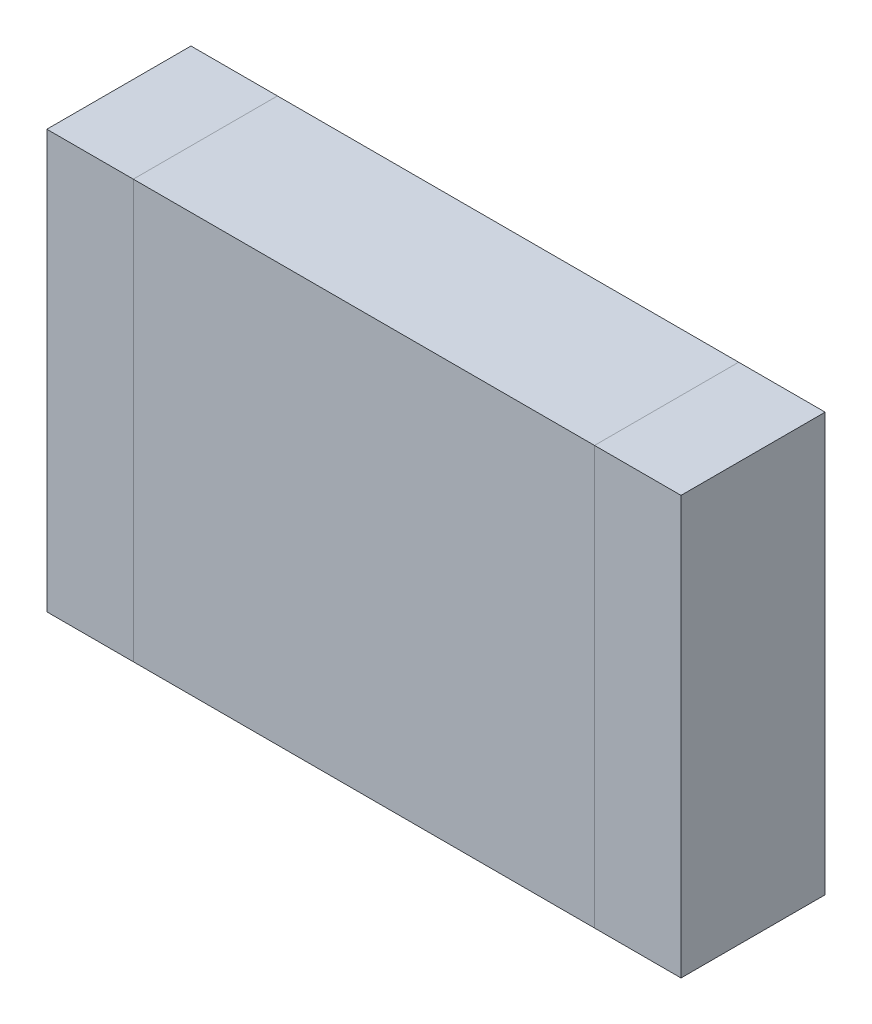
ISO-10303-21;
HEADER;
FILE_DESCRIPTION(('STEP AP214'),'2;1');
FILE_NAME('part.step','',(''),(''),'','','');
FILE_SCHEMA(('AUTOMOTIVE_DESIGN { 1 0 10303 214 1 1 1 1 }'));
ENDSEC;
DATA;
#1=APPLICATION_CONTEXT('core data for automotive mechanical design processes');
#2=APPLICATION_PROTOCOL_DEFINITION('international standard','automotive_design',2000,#1);
#3=PRODUCT_CONTEXT('',#1,'mechanical');
#4=PRODUCT('Part','Part','',(#3));
#5=PRODUCT_RELATED_PRODUCT_CATEGORY('part','',(#4));
#6=PRODUCT_DEFINITION_FORMATION('','',#4);
#7=PRODUCT_DEFINITION_CONTEXT('part definition',#1,'design');
#8=PRODUCT_DEFINITION('design','',#6,#7);
#9=PRODUCT_DEFINITION_SHAPE('','',#8);
#10=(LENGTH_UNIT() NAMED_UNIT(*) SI_UNIT(.MILLI.,.METRE.));
#11=(NAMED_UNIT(*) PLANE_ANGLE_UNIT() SI_UNIT($,.RADIAN.));
#12=(NAMED_UNIT(*) SI_UNIT($,.STERADIAN.) SOLID_ANGLE_UNIT());
#13=UNCERTAINTY_MEASURE_WITH_UNIT(LENGTH_MEASURE(1.E-05),#10,'distance_accuracy_value','');
#14=(GEOMETRIC_REPRESENTATION_CONTEXT(3) GLOBAL_UNCERTAINTY_ASSIGNED_CONTEXT((#13)) GLOBAL_UNIT_ASSIGNED_CONTEXT((#10,
#11,#12)) REPRESENTATION_CONTEXT('',''));
#15=CARTESIAN_POINT('',(0.,0.,0.));
#16=DIRECTION('',(0.,0.,1.));
#17=DIRECTION('',(1.,0.,0.));
#18=AXIS2_PLACEMENT_3D('',#15,#16,#17);
#19=CARTESIAN_POINT('',(1.10000038146973,-0.724999785423279,0.));
#20=DIRECTION('',(1.,0.,0.));
#21=DIRECTION('',(0.,0.,-1.));
#22=AXIS2_PLACEMENT_3D('',#19,#20,#21);
#23=PLANE('',#22);
#24=DIRECTION('',(0.,1.,0.));
#25=VECTOR('',#24,1.);
#26=CARTESIAN_POINT('',(1.10000038146973,1.39999973773956,0.499998986721039));
#27=LINE('',#26,#25);
#28=CARTESIAN_POINT('',(1.10000038146973,-0.724999785423279,0.499998986721039));
#29=VERTEX_POINT('',#28);
#30=CARTESIAN_POINT('',(1.10000038146973,0.724999845027924,0.499998986721039));
#31=VERTEX_POINT('',#30);
#32=EDGE_CURVE('P0_E69',#29,#31,#27,.T.);
#33=ORIENTED_EDGE('',*,*,#32,.F.);
#34=DIRECTION('',(0.,0.,-1.));
#35=VECTOR('',#34,1.);
#36=CARTESIAN_POINT('',(1.10000038146973,-0.724999785423279,0.));
#37=LINE('',#36,#35);
#38=CARTESIAN_POINT('',(1.10000038146973,-0.724999785423279,0.));
#39=VERTEX_POINT('',#38);
#40=EDGE_CURVE('P0_E56',#39,#29,#37,.F.);
#41=ORIENTED_EDGE('',*,*,#40,.F.);
#42=DIRECTION('',(0.,1.,0.));
#43=VECTOR('',#42,1.);
#44=CARTESIAN_POINT('',(1.10000038146973,1.39999973773956,0.));
#45=LINE('',#44,#43);
#46=CARTESIAN_POINT('',(1.10000038146973,0.724999845027924,0.));
#47=VERTEX_POINT('',#46);
#48=EDGE_CURVE('P0_E62',#39,#47,#45,.T.);
#49=ORIENTED_EDGE('',*,*,#48,.T.);
#50=DIRECTION('',(0.,0.,-1.));
#51=VECTOR('',#50,1.);
#52=CARTESIAN_POINT('',(1.10000038146973,0.724999845027924,0.));
#53=LINE('',#52,#51);
#54=EDGE_CURVE('P0_E20',#47,#31,#53,.F.);
#55=ORIENTED_EDGE('',*,*,#54,.T.);
#56=EDGE_LOOP('',(#33,#41,#49,#55));
#57=FACE_BOUND('',#56,.T.);
#58=ADVANCED_FACE('P0_F17',(#57),#23,.T.);
#59=CARTESIAN_POINT('',(-19.3250007629395,1.39999973773956,0.));
#60=DIRECTION('',(0.,0.,1.));
#61=DIRECTION('',(1.,0.,0.));
#62=AXIS2_PLACEMENT_3D('',#59,#60,#61);
#63=PLANE('',#62);
#64=ORIENTED_EDGE('',*,*,#48,.F.);
#65=DIRECTION('',(1.,0.,0.));
#66=VECTOR('',#65,1.);
#67=CARTESIAN_POINT('',(0.80000114440918,-0.724999785423279,0.));
#68=LINE('',#67,#66);
#69=CARTESIAN_POINT('',(0.80000114440918,-0.724999785423279,0.));
#70=VERTEX_POINT('',#69);
#71=EDGE_CURVE('P0_E64',#70,#39,#68,.T.);
#72=ORIENTED_EDGE('',*,*,#71,.F.);
#73=DIRECTION('',(0.,1.,0.));
#74=VECTOR('',#73,1.);
#75=CARTESIAN_POINT('',(0.80000114440918,0.724999845027924,0.));
#76=LINE('',#75,#74);
#77=CARTESIAN_POINT('',(0.80000114440918,0.724999845027924,0.));
#78=VERTEX_POINT('',#77);
#79=EDGE_CURVE('P0_E83',#78,#70,#76,.F.);
#80=ORIENTED_EDGE('',*,*,#79,.F.);
#81=DIRECTION('',(1.,0.,0.));
#82=VECTOR('',#81,1.);
#83=CARTESIAN_POINT('',(1.10000038146973,0.724999845027924,0.));
#84=LINE('',#83,#82);
#85=EDGE_CURVE('P0_E67',#47,#78,#84,.F.);
#86=ORIENTED_EDGE('',*,*,#85,.F.);
#87=EDGE_LOOP('',(#64,#72,#80,#86));
#88=FACE_BOUND('',#87,.T.);
#89=ADVANCED_FACE('P0_F63',(#88),#63,.F.);
#90=CARTESIAN_POINT('',(0.80000114440918,-0.724999785423279,0.));
#91=DIRECTION('',(0.,-1.,0.));
#92=DIRECTION('',(0.,0.,-1.));
#93=AXIS2_PLACEMENT_3D('',#90,#91,#92);
#94=PLANE('',#93);
#95=DIRECTION('',(1.,0.,0.));
#96=VECTOR('',#95,1.);
#97=CARTESIAN_POINT('',(-19.3250007629395,-0.724999785423279,0.499998986721039));
#98=LINE('',#97,#96);
#99=CARTESIAN_POINT('',(0.80000114440918,-0.724999785423279,0.499998986721039));
#100=VERTEX_POINT('',#99);
#101=EDGE_CURVE('P0_E71',#100,#29,#98,.T.);
#102=ORIENTED_EDGE('',*,*,#101,.F.);
#103=DIRECTION('',(0.,0.,1.));
#104=VECTOR('',#103,1.);
#105=CARTESIAN_POINT('',(0.80000114440918,-0.724999785423279,0.));
#106=LINE('',#105,#104);
#107=EDGE_CURVE('P0_E75',#70,#100,#106,.T.);
#108=ORIENTED_EDGE('',*,*,#107,.F.);
#109=ORIENTED_EDGE('',*,*,#71,.T.);
#110=ORIENTED_EDGE('',*,*,#40,.T.);
#111=EDGE_LOOP('',(#102,#108,#109,#110));
#112=FACE_BOUND('',#111,.T.);
#113=ADVANCED_FACE('P0_F73',(#112),#94,.T.);
#114=CARTESIAN_POINT('',(-19.3250007629395,1.39999973773956,0.499998986721039));
#115=DIRECTION('',(0.,0.,1.));
#116=DIRECTION('',(1.,0.,0.));
#117=AXIS2_PLACEMENT_3D('',#114,#115,#116);
#118=PLANE('',#117);
#119=ORIENTED_EDGE('',*,*,#32,.T.);
#120=DIRECTION('',(1.,0.,0.));
#121=VECTOR('',#120,1.);
#122=CARTESIAN_POINT('',(1.10000038146973,0.724999845027924,0.499998986721039));
#123=LINE('',#122,#121);
#124=CARTESIAN_POINT('',(0.80000114440918,0.724999845027924,0.499998986721039));
#125=VERTEX_POINT('',#124);
#126=EDGE_CURVE('P0_E35',#125,#31,#123,.T.);
#127=ORIENTED_EDGE('',*,*,#126,.F.);
#128=DIRECTION('',(0.,1.,0.));
#129=VECTOR('',#128,1.);
#130=CARTESIAN_POINT('',(0.80000114440918,0.724999845027924,0.499998986721039));
#131=LINE('',#130,#129);
#132=EDGE_CURVE('P0_E26',#100,#125,#131,.T.);
#133=ORIENTED_EDGE('',*,*,#132,.F.);
#134=ORIENTED_EDGE('',*,*,#101,.T.);
#135=EDGE_LOOP('',(#119,#127,#133,#134));
#136=FACE_BOUND('',#135,.T.);
#137=ADVANCED_FACE('P0_F89',(#136),#118,.T.);
#138=CARTESIAN_POINT('',(1.10000038146973,0.724999845027924,0.));
#139=DIRECTION('',(0.,1.,0.));
#140=DIRECTION('',(0.,0.,1.));
#141=AXIS2_PLACEMENT_3D('',#138,#139,#140);
#142=PLANE('',#141);
#143=ORIENTED_EDGE('',*,*,#126,.T.);
#144=ORIENTED_EDGE('',*,*,#54,.F.);
#145=ORIENTED_EDGE('',*,*,#85,.T.);
#146=DIRECTION('',(0.,0.,1.));
#147=VECTOR('',#146,1.);
#148=CARTESIAN_POINT('',(0.80000114440918,0.724999845027924,0.));
#149=LINE('',#148,#147);
#150=EDGE_CURVE('P0_E11',#125,#78,#149,.F.);
#151=ORIENTED_EDGE('',*,*,#150,.F.);
#152=EDGE_LOOP('',(#143,#144,#145,#151));
#153=FACE_BOUND('',#152,.T.);
#154=ADVANCED_FACE('P0_F91',(#153),#142,.T.);
#155=CARTESIAN_POINT('',(0.80000114440918,0.724999845027924,0.));
#156=DIRECTION('',(-1.,0.,0.));
#157=DIRECTION('',(0.,0.,1.));
#158=AXIS2_PLACEMENT_3D('',#155,#156,#157);
#159=PLANE('',#158);
#160=ORIENTED_EDGE('',*,*,#132,.T.);
#161=ORIENTED_EDGE('',*,*,#150,.T.);
#162=ORIENTED_EDGE('',*,*,#79,.T.);
#163=ORIENTED_EDGE('',*,*,#107,.T.);
#164=EDGE_LOOP('',(#160,#161,#162,#163));
#165=FACE_BOUND('',#164,.T.);
#166=ADVANCED_FACE('P0_F88',(#165),#159,.T.);
#167=CLOSED_SHELL('',(#58,#89,#113,#137,#154,#166));
#168=MANIFOLD_SOLID_BREP('P0_B1',#167);
#169=CARTESIAN_POINT('',(-19.3250007629395,1.39999973773956,0.));
#170=DIRECTION('',(0.,0.,1.));
#171=DIRECTION('',(1.,0.,0.));
#172=AXIS2_PLACEMENT_3D('',#169,#170,#171);
#173=PLANE('',#172);
#174=DIRECTION('',(0.,1.,0.));
#175=VECTOR('',#174,1.);
#176=CARTESIAN_POINT('',(0.80000114440918,-0.724999785423279,0.));
#177=LINE('',#176,#175);
#178=CARTESIAN_POINT('',(0.80000114440918,-0.724999785423279,0.));
#179=VERTEX_POINT('',#178);
#180=CARTESIAN_POINT('',(0.80000114440918,0.724999845027924,0.));
#181=VERTEX_POINT('',#180);
#182=EDGE_CURVE('P1_E55',#179,#181,#177,.T.);
#183=ORIENTED_EDGE('',*,*,#182,.F.);
#184=DIRECTION('',(1.,0.,0.));
#185=VECTOR('',#184,1.);
#186=CARTESIAN_POINT('',(-0.799999237060547,-0.724999785423279,0.));
#187=LINE('',#186,#185);
#188=CARTESIAN_POINT('',(-0.799999237060547,-0.724999785423279,0.));
#189=VERTEX_POINT('',#188);
#190=EDGE_CURVE('P1_E57',#189,#179,#187,.T.);
#191=ORIENTED_EDGE('',*,*,#190,.F.);
#192=DIRECTION('',(0.,1.,0.));
#193=VECTOR('',#192,1.);
#194=CARTESIAN_POINT('',(-0.799999237060547,0.724999845027924,0.));
#195=LINE('',#194,#193);
#196=CARTESIAN_POINT('',(-0.799999237060547,0.724999845027924,0.));
#197=VERTEX_POINT('',#196);
#198=EDGE_CURVE('P1_E20',#197,#189,#195,.F.);
#199=ORIENTED_EDGE('',*,*,#198,.F.);
#200=DIRECTION('',(1.,0.,0.));
#201=VECTOR('',#200,1.);
#202=CARTESIAN_POINT('',(0.80000114440918,0.724999845027924,0.));
#203=LINE('',#202,#201);
#204=EDGE_CURVE('P1_E79',#181,#197,#203,.F.);
#205=ORIENTED_EDGE('',*,*,#204,.F.);
#206=EDGE_LOOP('',(#183,#191,#199,#205));
#207=FACE_BOUND('',#206,.T.);
#208=ADVANCED_FACE('P1_F17',(#207),#173,.F.);
#209=CARTESIAN_POINT('',(-0.799999237060547,0.724999845027924,0.));
#210=DIRECTION('',(-1.,0.,0.));
#211=DIRECTION('',(0.,0.,1.));
#212=AXIS2_PLACEMENT_3D('',#209,#210,#211);
#213=PLANE('',#212);
#214=DIRECTION('',(0.,1.,0.));
#215=VECTOR('',#214,1.);
#216=CARTESIAN_POINT('',(-0.799999237060547,1.39999973773956,0.499998986721039));
#217=LINE('',#216,#215);
#218=CARTESIAN_POINT('',(-0.799999237060547,0.724999845027924,0.499998986721039));
#219=VERTEX_POINT('',#218);
#220=CARTESIAN_POINT('',(-0.799999237060547,-0.724999785423279,0.499998986721039));
#221=VERTEX_POINT('',#220);
#222=EDGE_CURVE('P1_E83',#219,#221,#217,.F.);
#223=ORIENTED_EDGE('',*,*,#222,.F.);
#224=DIRECTION('',(0.,0.,1.));
#225=VECTOR('',#224,1.);
#226=CARTESIAN_POINT('',(-0.799999237060547,0.724999845027924,0.));
#227=LINE('',#226,#225);
#228=EDGE_CURVE('P1_E68',#197,#219,#227,.T.);
#229=ORIENTED_EDGE('',*,*,#228,.F.);
#230=ORIENTED_EDGE('',*,*,#198,.T.);
#231=DIRECTION('',(0.,0.,-1.));
#232=VECTOR('',#231,1.);
#233=CARTESIAN_POINT('',(-0.799999237060547,-0.724999785423279,0.));
#234=LINE('',#233,#232);
#235=EDGE_CURVE('P1_E63',#221,#189,#234,.T.);
#236=ORIENTED_EDGE('',*,*,#235,.F.);
#237=EDGE_LOOP('',(#223,#229,#230,#236));
#238=FACE_BOUND('',#237,.T.);
#239=ADVANCED_FACE('P1_F65',(#238),#213,.T.);
#240=CARTESIAN_POINT('',(-0.799999237060547,-0.724999785423279,0.));
#241=DIRECTION('',(0.,-1.,0.));
#242=DIRECTION('',(0.,0.,-1.));
#243=AXIS2_PLACEMENT_3D('',#240,#241,#242);
#244=PLANE('',#243);
#245=DIRECTION('',(1.,0.,0.));
#246=VECTOR('',#245,1.);
#247=CARTESIAN_POINT('',(-19.3250007629395,-0.724999785423279,0.499998986721039));
#248=LINE('',#247,#246);
#249=CARTESIAN_POINT('',(0.80000114440918,-0.724999785423279,0.499998986721039));
#250=VERTEX_POINT('',#249);
#251=EDGE_CURVE('P1_E72',#221,#250,#248,.T.);
#252=ORIENTED_EDGE('',*,*,#251,.F.);
#253=ORIENTED_EDGE('',*,*,#235,.T.);
#254=ORIENTED_EDGE('',*,*,#190,.T.);
#255=DIRECTION('',(0.,0.,-1.));
#256=VECTOR('',#255,1.);
#257=CARTESIAN_POINT('',(0.80000114440918,-0.724999785423279,0.));
#258=LINE('',#257,#256);
#259=EDGE_CURVE('P1_E75',#250,#179,#258,.T.);
#260=ORIENTED_EDGE('',*,*,#259,.F.);
#261=EDGE_LOOP('',(#252,#253,#254,#260));
#262=FACE_BOUND('',#261,.T.);
#263=ADVANCED_FACE('P1_F70',(#262),#244,.T.);
#264=CARTESIAN_POINT('',(0.80000114440918,-0.724999785423279,0.));
#265=DIRECTION('',(1.,0.,0.));
#266=DIRECTION('',(0.,0.,-1.));
#267=AXIS2_PLACEMENT_3D('',#264,#265,#266);
#268=PLANE('',#267);
#269=DIRECTION('',(0.,1.,0.));
#270=VECTOR('',#269,1.);
#271=CARTESIAN_POINT('',(0.800001144409181,1.39999973773956,0.499998986721039));
#272=LINE('',#271,#270);
#273=CARTESIAN_POINT('',(0.80000114440918,0.724999845027924,0.499998986721039));
#274=VERTEX_POINT('',#273);
#275=EDGE_CURVE('P1_E26',#250,#274,#272,.T.);
#276=ORIENTED_EDGE('',*,*,#275,.F.);
#277=ORIENTED_EDGE('',*,*,#259,.T.);
#278=ORIENTED_EDGE('',*,*,#182,.T.);
#279=DIRECTION('',(0.,0.,1.));
#280=VECTOR('',#279,1.);
#281=CARTESIAN_POINT('',(0.80000114440918,0.724999845027924,0.));
#282=LINE('',#281,#280);
#283=EDGE_CURVE('P1_E35',#274,#181,#282,.F.);
#284=ORIENTED_EDGE('',*,*,#283,.F.);
#285=EDGE_LOOP('',(#276,#277,#278,#284));
#286=FACE_BOUND('',#285,.T.);
#287=ADVANCED_FACE('P1_F89',(#286),#268,.T.);
#288=CARTESIAN_POINT('',(0.80000114440918,0.724999845027924,0.));
#289=DIRECTION('',(0.,1.,0.));
#290=DIRECTION('',(0.,0.,1.));
#291=AXIS2_PLACEMENT_3D('',#288,#289,#290);
#292=PLANE('',#291);
#293=DIRECTION('',(1.,0.,0.));
#294=VECTOR('',#293,1.);
#295=CARTESIAN_POINT('',(-19.3250007629395,0.724999845027924,0.499998986721039));
#296=LINE('',#295,#294);
#297=EDGE_CURVE('P1_E11',#274,#219,#296,.F.);
#298=ORIENTED_EDGE('',*,*,#297,.F.);
#299=ORIENTED_EDGE('',*,*,#283,.T.);
#300=ORIENTED_EDGE('',*,*,#204,.T.);
#301=ORIENTED_EDGE('',*,*,#228,.T.);
#302=EDGE_LOOP('',(#298,#299,#300,#301));
#303=FACE_BOUND('',#302,.T.);
#304=ADVANCED_FACE('P1_F91',(#303),#292,.T.);
#305=CARTESIAN_POINT('',(-19.3250007629395,1.39999973773956,0.499998986721039));
#306=DIRECTION('',(0.,0.,1.));
#307=DIRECTION('',(1.,0.,0.));
#308=AXIS2_PLACEMENT_3D('',#305,#306,#307);
#309=PLANE('',#308);
#310=ORIENTED_EDGE('',*,*,#275,.T.);
#311=ORIENTED_EDGE('',*,*,#297,.T.);
#312=ORIENTED_EDGE('',*,*,#222,.T.);
#313=ORIENTED_EDGE('',*,*,#251,.T.);
#314=EDGE_LOOP('',(#310,#311,#312,#313));
#315=FACE_BOUND('',#314,.T.);
#316=ADVANCED_FACE('P1_F88',(#315),#309,.T.);
#317=CLOSED_SHELL('',(#208,#239,#263,#287,#304,#316));
#318=MANIFOLD_SOLID_BREP('P1_B1',#317);
#319=CARTESIAN_POINT('',(-0.799999237060547,-0.724999785423279,0.));
#320=DIRECTION('',(1.,0.,0.));
#321=DIRECTION('',(0.,0.,-1.));
#322=AXIS2_PLACEMENT_3D('',#319,#320,#321);
#323=PLANE('',#322);
#324=DIRECTION('',(0.,1.,0.));
#325=VECTOR('',#324,1.);
#326=CARTESIAN_POINT('',(-0.799999237060547,1.39999973773956,0.499998986721039));
#327=LINE('',#326,#325);
#328=CARTESIAN_POINT('',(-0.799999237060547,-0.724999785423279,0.499998986721039));
#329=VERTEX_POINT('',#328);
#330=CARTESIAN_POINT('',(-0.799999237060547,0.724999845027924,0.499998986721039));
#331=VERTEX_POINT('',#330);
#332=EDGE_CURVE('P2_E69',#329,#331,#327,.T.);
#333=ORIENTED_EDGE('',*,*,#332,.F.);
#334=DIRECTION('',(0.,0.,-1.));
#335=VECTOR('',#334,1.);
#336=CARTESIAN_POINT('',(-0.799999237060547,-0.724999785423279,0.));
#337=LINE('',#336,#335);
#338=CARTESIAN_POINT('',(-0.799999237060547,-0.724999785423279,0.));
#339=VERTEX_POINT('',#338);
#340=EDGE_CURVE('P2_E56',#339,#329,#337,.F.);
#341=ORIENTED_EDGE('',*,*,#340,.F.);
#342=DIRECTION('',(0.,1.,0.));
#343=VECTOR('',#342,1.);
#344=CARTESIAN_POINT('',(-0.799999237060547,1.39999973773956,0.));
#345=LINE('',#344,#343);
#346=CARTESIAN_POINT('',(-0.799999237060547,0.724999845027924,0.));
#347=VERTEX_POINT('',#346);
#348=EDGE_CURVE('P2_E62',#339,#347,#345,.T.);
#349=ORIENTED_EDGE('',*,*,#348,.T.);
#350=DIRECTION('',(0.,0.,-1.));
#351=VECTOR('',#350,1.);
#352=CARTESIAN_POINT('',(-0.799999237060547,0.724999845027924,0.));
#353=LINE('',#352,#351);
#354=EDGE_CURVE('P2_E20',#347,#331,#353,.F.);
#355=ORIENTED_EDGE('',*,*,#354,.T.);
#356=EDGE_LOOP('',(#333,#341,#349,#355));
#357=FACE_BOUND('',#356,.T.);
#358=ADVANCED_FACE('P2_F17',(#357),#323,.T.);
#359=CARTESIAN_POINT('',(-19.3250007629395,1.39999973773956,0.));
#360=DIRECTION('',(0.,0.,1.));
#361=DIRECTION('',(1.,0.,0.));
#362=AXIS2_PLACEMENT_3D('',#359,#360,#361);
#363=PLANE('',#362);
#364=ORIENTED_EDGE('',*,*,#348,.F.);
#365=DIRECTION('',(1.,0.,0.));
#366=VECTOR('',#365,1.);
#367=CARTESIAN_POINT('',(-1.10000038146973,-0.724999785423279,0.));
#368=LINE('',#367,#366);
#369=CARTESIAN_POINT('',(-1.10000038146973,-0.724999785423279,0.));
#370=VERTEX_POINT('',#369);
#371=EDGE_CURVE('P2_E64',#370,#339,#368,.T.);
#372=ORIENTED_EDGE('',*,*,#371,.F.);
#373=DIRECTION('',(0.,1.,0.));
#374=VECTOR('',#373,1.);
#375=CARTESIAN_POINT('',(-1.10000038146973,0.724999845027924,0.));
#376=LINE('',#375,#374);
#377=CARTESIAN_POINT('',(-1.10000038146973,0.724999845027924,0.));
#378=VERTEX_POINT('',#377);
#379=EDGE_CURVE('P2_E83',#378,#370,#376,.F.);
#380=ORIENTED_EDGE('',*,*,#379,.F.);
#381=DIRECTION('',(1.,0.,0.));
#382=VECTOR('',#381,1.);
#383=CARTESIAN_POINT('',(-0.799999237060547,0.724999845027924,0.));
#384=LINE('',#383,#382);
#385=EDGE_CURVE('P2_E67',#347,#378,#384,.F.);
#386=ORIENTED_EDGE('',*,*,#385,.F.);
#387=EDGE_LOOP('',(#364,#372,#380,#386));
#388=FACE_BOUND('',#387,.T.);
#389=ADVANCED_FACE('P2_F63',(#388),#363,.F.);
#390=CARTESIAN_POINT('',(-1.10000038146973,-0.724999785423279,0.));
#391=DIRECTION('',(0.,-1.,0.));
#392=DIRECTION('',(0.,0.,-1.));
#393=AXIS2_PLACEMENT_3D('',#390,#391,#392);
#394=PLANE('',#393);
#395=DIRECTION('',(1.,0.,0.));
#396=VECTOR('',#395,1.);
#397=CARTESIAN_POINT('',(-19.3250007629395,-0.724999785423279,0.499998986721039));
#398=LINE('',#397,#396);
#399=CARTESIAN_POINT('',(-1.10000038146973,-0.724999785423279,0.499998986721039));
#400=VERTEX_POINT('',#399);
#401=EDGE_CURVE('P2_E71',#400,#329,#398,.T.);
#402=ORIENTED_EDGE('',*,*,#401,.F.);
#403=DIRECTION('',(0.,0.,1.));
#404=VECTOR('',#403,1.);
#405=CARTESIAN_POINT('',(-1.10000038146973,-0.724999785423279,0.));
#406=LINE('',#405,#404);
#407=EDGE_CURVE('P2_E75',#370,#400,#406,.T.);
#408=ORIENTED_EDGE('',*,*,#407,.F.);
#409=ORIENTED_EDGE('',*,*,#371,.T.);
#410=ORIENTED_EDGE('',*,*,#340,.T.);
#411=EDGE_LOOP('',(#402,#408,#409,#410));
#412=FACE_BOUND('',#411,.T.);
#413=ADVANCED_FACE('P2_F73',(#412),#394,.T.);
#414=CARTESIAN_POINT('',(-19.3250007629395,1.39999973773956,0.499998986721039));
#415=DIRECTION('',(0.,0.,1.));
#416=DIRECTION('',(1.,0.,0.));
#417=AXIS2_PLACEMENT_3D('',#414,#415,#416);
#418=PLANE('',#417);
#419=ORIENTED_EDGE('',*,*,#332,.T.);
#420=DIRECTION('',(1.,0.,0.));
#421=VECTOR('',#420,1.);
#422=CARTESIAN_POINT('',(-0.799999237060547,0.724999845027924,0.499998986721039));
#423=LINE('',#422,#421);
#424=CARTESIAN_POINT('',(-1.10000038146973,0.724999845027924,0.499998986721039));
#425=VERTEX_POINT('',#424);
#426=EDGE_CURVE('P2_E35',#425,#331,#423,.T.);
#427=ORIENTED_EDGE('',*,*,#426,.F.);
#428=DIRECTION('',(0.,1.,0.));
#429=VECTOR('',#428,1.);
#430=CARTESIAN_POINT('',(-1.10000038146973,0.724999845027924,0.499998986721039));
#431=LINE('',#430,#429);
#432=EDGE_CURVE('P2_E26',#400,#425,#431,.T.);
#433=ORIENTED_EDGE('',*,*,#432,.F.);
#434=ORIENTED_EDGE('',*,*,#401,.T.);
#435=EDGE_LOOP('',(#419,#427,#433,#434));
#436=FACE_BOUND('',#435,.T.);
#437=ADVANCED_FACE('P2_F89',(#436),#418,.T.);
#438=CARTESIAN_POINT('',(-0.799999237060547,0.724999845027924,0.));
#439=DIRECTION('',(0.,1.,0.));
#440=DIRECTION('',(0.,0.,1.));
#441=AXIS2_PLACEMENT_3D('',#438,#439,#440);
#442=PLANE('',#441);
#443=ORIENTED_EDGE('',*,*,#426,.T.);
#444=ORIENTED_EDGE('',*,*,#354,.F.);
#445=ORIENTED_EDGE('',*,*,#385,.T.);
#446=DIRECTION('',(0.,0.,1.));
#447=VECTOR('',#446,1.);
#448=CARTESIAN_POINT('',(-1.10000038146973,0.724999845027924,0.));
#449=LINE('',#448,#447);
#450=EDGE_CURVE('P2_E11',#425,#378,#449,.F.);
#451=ORIENTED_EDGE('',*,*,#450,.F.);
#452=EDGE_LOOP('',(#443,#444,#445,#451));
#453=FACE_BOUND('',#452,.T.);
#454=ADVANCED_FACE('P2_F91',(#453),#442,.T.);
#455=CARTESIAN_POINT('',(-1.10000038146973,0.724999845027924,0.));
#456=DIRECTION('',(-1.,0.,0.));
#457=DIRECTION('',(0.,0.,1.));
#458=AXIS2_PLACEMENT_3D('',#455,#456,#457);
#459=PLANE('',#458);
#460=ORIENTED_EDGE('',*,*,#432,.T.);
#461=ORIENTED_EDGE('',*,*,#450,.T.);
#462=ORIENTED_EDGE('',*,*,#379,.T.);
#463=ORIENTED_EDGE('',*,*,#407,.T.);
#464=EDGE_LOOP('',(#460,#461,#462,#463));
#465=FACE_BOUND('',#464,.T.);
#466=ADVANCED_FACE('P2_F88',(#465),#459,.T.);
#467=CLOSED_SHELL('',(#358,#389,#413,#437,#454,#466));
#468=MANIFOLD_SOLID_BREP('P2_B1',#467);
#469=ADVANCED_BREP_SHAPE_REPRESENTATION('',(#18,#168,#318,#468),#14);
#470=SHAPE_DEFINITION_REPRESENTATION(#9,#469);
ENDSEC;
END-ISO-10303-21;
